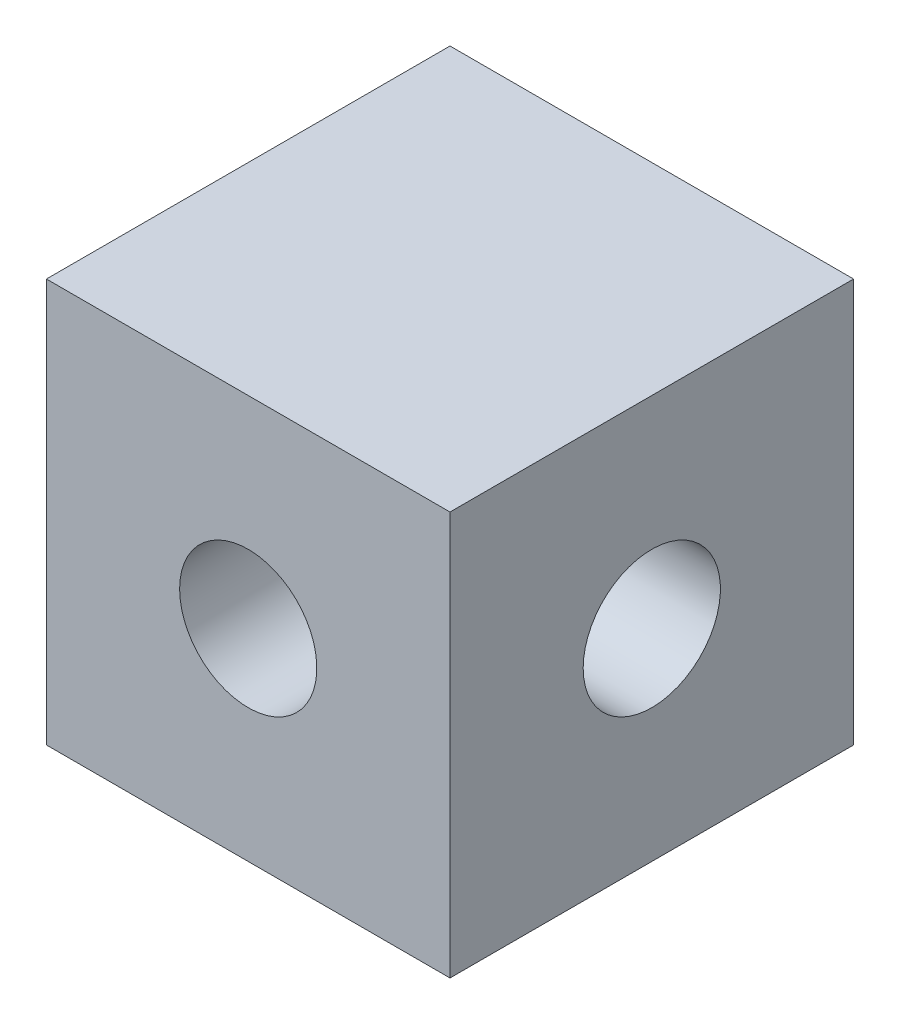
ISO-10303-21;
HEADER;
FILE_DESCRIPTION(('STEP AP214'),'2;1');
FILE_NAME('part.step','',(''),(''),'','','');
FILE_SCHEMA(('AUTOMOTIVE_DESIGN { 1 0 10303 214 1 1 1 1 }'));
ENDSEC;
DATA;
#1=APPLICATION_CONTEXT('core data for automotive mechanical design processes');
#2=APPLICATION_PROTOCOL_DEFINITION('international standard','automotive_design',2000,#1);
#3=PRODUCT_CONTEXT('',#1,'mechanical');
#4=PRODUCT('Part','Part','',(#3));
#5=PRODUCT_RELATED_PRODUCT_CATEGORY('part','',(#4));
#6=PRODUCT_DEFINITION_FORMATION('','',#4);
#7=PRODUCT_DEFINITION_CONTEXT('part definition',#1,'design');
#8=PRODUCT_DEFINITION('design','',#6,#7);
#9=PRODUCT_DEFINITION_SHAPE('','',#8);
#10=(LENGTH_UNIT() NAMED_UNIT(*) SI_UNIT(.MILLI.,.METRE.));
#11=(NAMED_UNIT(*) PLANE_ANGLE_UNIT() SI_UNIT($,.RADIAN.));
#12=(NAMED_UNIT(*) SI_UNIT($,.STERADIAN.) SOLID_ANGLE_UNIT());
#13=UNCERTAINTY_MEASURE_WITH_UNIT(LENGTH_MEASURE(1.E-05),#10,'distance_accuracy_value','');
#14=(GEOMETRIC_REPRESENTATION_CONTEXT(3) GLOBAL_UNCERTAINTY_ASSIGNED_CONTEXT((#13)) GLOBAL_UNIT_ASSIGNED_CONTEXT((#10,
#11,#12)) REPRESENTATION_CONTEXT('',''));
#15=CARTESIAN_POINT('',(0.,0.,0.));
#16=DIRECTION('',(0.,0.,1.));
#17=DIRECTION('',(1.,0.,0.));
#18=AXIS2_PLACEMENT_3D('',#15,#16,#17);
#19=CARTESIAN_POINT('',(5.,5.,0.));
#20=DIRECTION('',(0.,0.,-1.));
#21=DIRECTION('',(-1.,0.,0.));
#22=AXIS2_PLACEMENT_3D('',#19,#20,#21);
#23=CYLINDRICAL_SURFACE('',#22,1.7);
#24=CARTESIAN_POINT('',(5.,5.,0.));
#25=DIRECTION('',(0.,0.,-1.));
#26=DIRECTION('',(-1.,0.,0.));
#27=AXIS2_PLACEMENT_3D('',#24,#25,#26);
#28=CIRCLE('',#27,1.7);
#29=CARTESIAN_POINT('',(3.3,5.,0.));
#30=VERTEX_POINT('',#29);
#31=EDGE_CURVE('E138',#30,#30,#28,.T.);
#32=ORIENTED_EDGE('',*,*,#31,.T.);
#33=EDGE_LOOP('',(#32));
#34=FACE_BOUND('',#33,.T.);
#35=CARTESIAN_POINT('',(5.,5.,5.));
#36=DIRECTION('',(0.707106781186547,0.,-0.707106781186547));
#37=DIRECTION('',(-0.707106781186547,0.,-0.707106781186547));
#38=AXIS2_PLACEMENT_3D('',#35,#36,#37);
#39=ELLIPSE('',#38,2.40416305603426,1.7);
#40=CARTESIAN_POINT('',(5.,6.7,5.));
#41=VERTEX_POINT('',#40);
#42=CARTESIAN_POINT('',(5.,3.3,5.));
#43=VERTEX_POINT('',#42);
#44=EDGE_CURVE('E57',#41,#43,#39,.F.);
#45=ORIENTED_EDGE('',*,*,#44,.T.);
#46=CARTESIAN_POINT('',(5.,5.,5.));
#47=DIRECTION('',(-0.707106781186547,0.,-0.707106781186547));
#48=DIRECTION('',(0.707106781186547,0.,-0.707106781186547));
#49=AXIS2_PLACEMENT_3D('',#46,#47,#48);
#50=ELLIPSE('',#49,2.40416305603426,1.7);
#51=EDGE_CURVE('E13',#43,#41,#50,.F.);
#52=ORIENTED_EDGE('',*,*,#51,.T.);
#53=EDGE_LOOP('',(#45,#52));
#54=FACE_BOUND('',#53,.T.);
#55=ADVANCED_FACE('F44',(#34,#54),#23,.F.);
#56=CARTESIAN_POINT('',(0.,0.,10.));
#57=DIRECTION('',(1.,0.,0.));
#58=DIRECTION('',(0.,0.,-1.));
#59=AXIS2_PLACEMENT_3D('',#56,#57,#58);
#60=PLANE('',#59);
#61=CARTESIAN_POINT('',(0.,5.,5.));
#62=DIRECTION('',(-1.,0.,0.));
#63=DIRECTION('',(0.,0.,1.));
#64=AXIS2_PLACEMENT_3D('',#61,#62,#63);
#65=CIRCLE('',#64,1.7);
#66=CARTESIAN_POINT('',(0.,5.,6.7));
#67=VERTEX_POINT('',#66);
#68=EDGE_CURVE('E144',#67,#67,#65,.T.);
#69=ORIENTED_EDGE('',*,*,#68,.F.);
#70=EDGE_LOOP('',(#69));
#71=FACE_BOUND('',#70,.T.);
#72=DIRECTION('',(0.,-1.,0.));
#73=VECTOR('',#72,1.);
#74=CARTESIAN_POINT('',(0.,0.,0.));
#75=LINE('',#74,#73);
#76=CARTESIAN_POINT('',(0.,10.,0.));
#77=VERTEX_POINT('',#76);
#78=CARTESIAN_POINT('',(0.,0.,0.));
#79=VERTEX_POINT('',#78);
#80=EDGE_CURVE('E127',#77,#79,#75,.T.);
#81=ORIENTED_EDGE('',*,*,#80,.T.);
#82=DIRECTION('',(0.,0.,-1.));
#83=VECTOR('',#82,1.);
#84=CARTESIAN_POINT('',(0.,0.,10.));
#85=LINE('',#84,#83);
#86=CARTESIAN_POINT('',(0.,0.,10.));
#87=VERTEX_POINT('',#86);
#88=EDGE_CURVE('E108',#87,#79,#85,.T.);
#89=ORIENTED_EDGE('',*,*,#88,.F.);
#90=DIRECTION('',(0.,-1.,0.));
#91=VECTOR('',#90,1.);
#92=CARTESIAN_POINT('',(0.,0.,10.));
#93=LINE('',#92,#91);
#94=CARTESIAN_POINT('',(0.,10.,10.));
#95=VERTEX_POINT('',#94);
#96=EDGE_CURVE('E122',#95,#87,#93,.T.);
#97=ORIENTED_EDGE('',*,*,#96,.F.);
#98=DIRECTION('',(0.,0.,-1.));
#99=VECTOR('',#98,1.);
#100=CARTESIAN_POINT('',(0.,10.,10.));
#101=LINE('',#100,#99);
#102=EDGE_CURVE('E119',#95,#77,#101,.T.);
#103=ORIENTED_EDGE('',*,*,#102,.T.);
#104=EDGE_LOOP('',(#81,#89,#97,#103));
#105=FACE_BOUND('',#104,.T.);
#106=ADVANCED_FACE('F46',(#71,#105),#60,.F.);
#107=CARTESIAN_POINT('',(0.,0.,10.));
#108=DIRECTION('',(0.,1.,0.));
#109=DIRECTION('',(0.,0.,1.));
#110=AXIS2_PLACEMENT_3D('',#107,#108,#109);
#111=PLANE('',#110);
#112=DIRECTION('',(1.,0.,0.));
#113=VECTOR('',#112,1.);
#114=CARTESIAN_POINT('',(0.,0.,0.));
#115=LINE('',#114,#113);
#116=CARTESIAN_POINT('',(10.,0.,0.));
#117=VERTEX_POINT('',#116);
#118=EDGE_CURVE('E125',#79,#117,#115,.T.);
#119=ORIENTED_EDGE('',*,*,#118,.T.);
#120=DIRECTION('',(0.,0.,-1.));
#121=VECTOR('',#120,1.);
#122=CARTESIAN_POINT('',(10.,0.,10.));
#123=LINE('',#122,#121);
#124=CARTESIAN_POINT('',(10.,0.,10.));
#125=VERTEX_POINT('',#124);
#126=EDGE_CURVE('E114',#125,#117,#123,.T.);
#127=ORIENTED_EDGE('',*,*,#126,.F.);
#128=DIRECTION('',(1.,0.,0.));
#129=VECTOR('',#128,1.);
#130=CARTESIAN_POINT('',(0.,0.,10.));
#131=LINE('',#130,#129);
#132=EDGE_CURVE('E95',#87,#125,#131,.T.);
#133=ORIENTED_EDGE('',*,*,#132,.F.);
#134=ORIENTED_EDGE('',*,*,#88,.T.);
#135=EDGE_LOOP('',(#119,#127,#133,#134));
#136=FACE_BOUND('',#135,.T.);
#137=ADVANCED_FACE('F151',(#136),#111,.F.);
#138=CARTESIAN_POINT('',(10.,0.,10.));
#139=DIRECTION('',(-1.,0.,0.));
#140=DIRECTION('',(0.,0.,1.));
#141=AXIS2_PLACEMENT_3D('',#138,#139,#140);
#142=PLANE('',#141);
#143=CARTESIAN_POINT('',(10.,5.,5.));
#144=DIRECTION('',(-1.,0.,0.));
#145=DIRECTION('',(0.,0.,1.));
#146=AXIS2_PLACEMENT_3D('',#143,#144,#145);
#147=CIRCLE('',#146,1.7);
#148=CARTESIAN_POINT('',(10.,5.,6.7));
#149=VERTEX_POINT('',#148);
#150=EDGE_CURVE('E141',#149,#149,#147,.T.);
#151=ORIENTED_EDGE('',*,*,#150,.T.);
#152=EDGE_LOOP('',(#151));
#153=FACE_BOUND('',#152,.T.);
#154=DIRECTION('',(0.,1.,0.));
#155=VECTOR('',#154,1.);
#156=CARTESIAN_POINT('',(10.,0.,0.));
#157=LINE('',#156,#155);
#158=CARTESIAN_POINT('',(10.,10.,0.));
#159=VERTEX_POINT('',#158);
#160=EDGE_CURVE('E123',#117,#159,#157,.T.);
#161=ORIENTED_EDGE('',*,*,#160,.T.);
#162=DIRECTION('',(0.,0.,-1.));
#163=VECTOR('',#162,1.);
#164=CARTESIAN_POINT('',(10.,10.,10.));
#165=LINE('',#164,#163);
#166=CARTESIAN_POINT('',(10.,10.,10.));
#167=VERTEX_POINT('',#166);
#168=EDGE_CURVE('E117',#167,#159,#165,.T.);
#169=ORIENTED_EDGE('',*,*,#168,.F.);
#170=DIRECTION('',(0.,1.,0.));
#171=VECTOR('',#170,1.);
#172=CARTESIAN_POINT('',(10.,0.,10.));
#173=LINE('',#172,#171);
#174=EDGE_CURVE('E132',#125,#167,#173,.T.);
#175=ORIENTED_EDGE('',*,*,#174,.F.);
#176=ORIENTED_EDGE('',*,*,#126,.T.);
#177=EDGE_LOOP('',(#161,#169,#175,#176));
#178=FACE_BOUND('',#177,.T.);
#179=ADVANCED_FACE('F159',(#153,#178),#142,.F.);
#180=CARTESIAN_POINT('',(0.,10.,10.));
#181=DIRECTION('',(0.,-1.,0.));
#182=DIRECTION('',(0.,0.,-1.));
#183=AXIS2_PLACEMENT_3D('',#180,#181,#182);
#184=PLANE('',#183);
#185=DIRECTION('',(-1.,0.,0.));
#186=VECTOR('',#185,1.);
#187=CARTESIAN_POINT('',(0.,10.,0.));
#188=LINE('',#187,#186);
#189=EDGE_CURVE('E87',#159,#77,#188,.T.);
#190=ORIENTED_EDGE('',*,*,#189,.T.);
#191=ORIENTED_EDGE('',*,*,#102,.F.);
#192=DIRECTION('',(-1.,0.,0.));
#193=VECTOR('',#192,1.);
#194=CARTESIAN_POINT('',(0.,10.,10.));
#195=LINE('',#194,#193);
#196=EDGE_CURVE('E66',#167,#95,#195,.T.);
#197=ORIENTED_EDGE('',*,*,#196,.F.);
#198=ORIENTED_EDGE('',*,*,#168,.T.);
#199=EDGE_LOOP('',(#190,#191,#197,#198));
#200=FACE_BOUND('',#199,.T.);
#201=ADVANCED_FACE('F165',(#200),#184,.F.);
#202=CARTESIAN_POINT('',(0.,0.,10.));
#203=DIRECTION('',(0.,0.,-1.));
#204=DIRECTION('',(-1.,0.,0.));
#205=AXIS2_PLACEMENT_3D('',#202,#203,#204);
#206=PLANE('',#205);
#207=CARTESIAN_POINT('',(5.,5.,10.));
#208=DIRECTION('',(0.,0.,-1.));
#209=DIRECTION('',(-1.,0.,0.));
#210=AXIS2_PLACEMENT_3D('',#207,#208,#209);
#211=CIRCLE('',#210,1.7);
#212=CARTESIAN_POINT('',(3.3,5.,10.));
#213=VERTEX_POINT('',#212);
#214=EDGE_CURVE('E130',#213,#213,#211,.T.);
#215=ORIENTED_EDGE('',*,*,#214,.T.);
#216=EDGE_LOOP('',(#215));
#217=FACE_BOUND('',#216,.T.);
#218=ORIENTED_EDGE('',*,*,#96,.T.);
#219=ORIENTED_EDGE('',*,*,#132,.T.);
#220=ORIENTED_EDGE('',*,*,#174,.T.);
#221=ORIENTED_EDGE('',*,*,#196,.T.);
#222=EDGE_LOOP('',(#218,#219,#220,#221));
#223=FACE_BOUND('',#222,.T.);
#224=ADVANCED_FACE('F182',(#217,#223),#206,.F.);
#225=CARTESIAN_POINT('',(0.,0.,0.));
#226=DIRECTION('',(0.,0.,-1.));
#227=DIRECTION('',(-1.,0.,0.));
#228=AXIS2_PLACEMENT_3D('',#225,#226,#227);
#229=PLANE('',#228);
#230=ORIENTED_EDGE('',*,*,#31,.F.);
#231=EDGE_LOOP('',(#230));
#232=FACE_BOUND('',#231,.T.);
#233=ORIENTED_EDGE('',*,*,#80,.F.);
#234=ORIENTED_EDGE('',*,*,#189,.F.);
#235=ORIENTED_EDGE('',*,*,#160,.F.);
#236=ORIENTED_EDGE('',*,*,#118,.F.);
#237=EDGE_LOOP('',(#233,#234,#235,#236));
#238=FACE_BOUND('',#237,.T.);
#239=ADVANCED_FACE('F156',(#232,#238),#229,.T.);
#240=CARTESIAN_POINT('',(5.,5.,5.));
#241=DIRECTION('',(0.707106781186547,0.,-0.707106781186547));
#242=DIRECTION('',(-0.707106781186547,0.,-0.707106781186547));
#243=AXIS2_PLACEMENT_3D('',#240,#241,#242);
#244=ELLIPSE('',#243,2.40416305603426,1.7);
#245=EDGE_CURVE('E101',#41,#43,#244,.T.);
#246=ORIENTED_EDGE('',*,*,#245,.T.);
#247=CARTESIAN_POINT('',(5.,5.,5.));
#248=DIRECTION('',(-0.707106781186547,0.,-0.707106781186547));
#249=DIRECTION('',(0.707106781186547,0.,-0.707106781186547));
#250=AXIS2_PLACEMENT_3D('',#247,#248,#249);
#251=ELLIPSE('',#250,2.40416305603426,1.7);
#252=EDGE_CURVE('E52',#43,#41,#251,.T.);
#253=ORIENTED_EDGE('',*,*,#252,.T.);
#254=EDGE_LOOP('',(#246,#253));
#255=FACE_BOUND('',#254,.T.);
#256=ORIENTED_EDGE('',*,*,#214,.F.);
#257=EDGE_LOOP('',(#256));
#258=FACE_BOUND('',#257,.T.);
#259=ADVANCED_FACE('F110',(#255,#258),#23,.F.);
#260=CARTESIAN_POINT('',(0.,5.,5.));
#261=DIRECTION('',(-1.,0.,0.));
#262=DIRECTION('',(0.,0.,1.));
#263=AXIS2_PLACEMENT_3D('',#260,#261,#262);
#264=CYLINDRICAL_SURFACE('',#263,1.7);
#265=ORIENTED_EDGE('',*,*,#150,.F.);
#266=EDGE_LOOP('',(#265));
#267=FACE_BOUND('',#266,.T.);
#268=ORIENTED_EDGE('',*,*,#245,.F.);
#269=ORIENTED_EDGE('',*,*,#51,.F.);
#270=EDGE_LOOP('',(#268,#269));
#271=FACE_BOUND('',#270,.T.);
#272=ADVANCED_FACE('F102',(#267,#271),#264,.F.);
#273=ORIENTED_EDGE('',*,*,#68,.T.);
#274=EDGE_LOOP('',(#273));
#275=FACE_BOUND('',#274,.T.);
#276=ORIENTED_EDGE('',*,*,#44,.F.);
#277=ORIENTED_EDGE('',*,*,#252,.F.);
#278=EDGE_LOOP('',(#276,#277));
#279=FACE_BOUND('',#278,.T.);
#280=ADVANCED_FACE('F107',(#275,#279),#264,.F.);
#281=CLOSED_SHELL('',(#55,#106,#137,#179,#201,#224,#239,#259,#272,#280));
#282=MANIFOLD_SOLID_BREP('B2',#281);
#283=ADVANCED_BREP_SHAPE_REPRESENTATION('',(#18,#282),#14);
#284=SHAPE_DEFINITION_REPRESENTATION(#9,#283);
ENDSEC;
END-ISO-10303-21;
